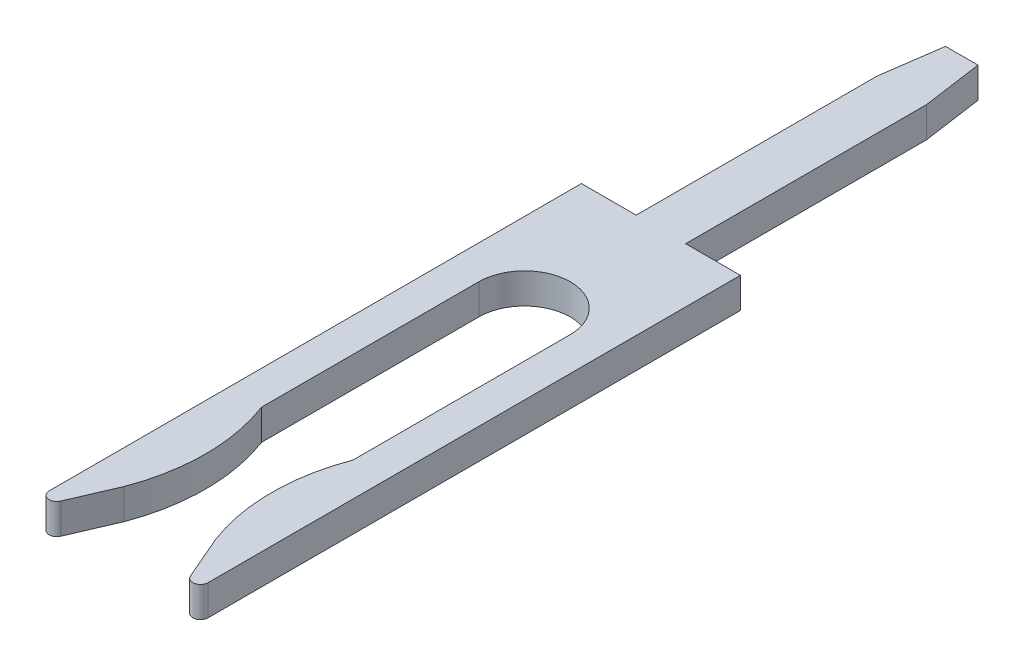
ISO-10303-21;
HEADER;
FILE_DESCRIPTION(('STEP AP214'),'2;1');
FILE_NAME('part.step','',(''),(''),'','','');
FILE_SCHEMA(('AUTOMOTIVE_DESIGN { 1 0 10303 214 1 1 1 1 }'));
ENDSEC;
DATA;
#1=APPLICATION_CONTEXT('core data for automotive mechanical design processes');
#2=APPLICATION_PROTOCOL_DEFINITION('international standard','automotive_design',2000,#1);
#3=PRODUCT_CONTEXT('',#1,'mechanical');
#4=PRODUCT('Part','Part','',(#3));
#5=PRODUCT_RELATED_PRODUCT_CATEGORY('part','',(#4));
#6=PRODUCT_DEFINITION_FORMATION('','',#4);
#7=PRODUCT_DEFINITION_CONTEXT('part definition',#1,'design');
#8=PRODUCT_DEFINITION('design','',#6,#7);
#9=PRODUCT_DEFINITION_SHAPE('','',#8);
#10=(LENGTH_UNIT() NAMED_UNIT(*) SI_UNIT(.MILLI.,.METRE.));
#11=(NAMED_UNIT(*) PLANE_ANGLE_UNIT() SI_UNIT($,.RADIAN.));
#12=(NAMED_UNIT(*) SI_UNIT($,.STERADIAN.) SOLID_ANGLE_UNIT());
#13=UNCERTAINTY_MEASURE_WITH_UNIT(LENGTH_MEASURE(1.E-05),#10,'distance_accuracy_value','');
#14=(GEOMETRIC_REPRESENTATION_CONTEXT(3) GLOBAL_UNCERTAINTY_ASSIGNED_CONTEXT((#13)) GLOBAL_UNIT_ASSIGNED_CONTEXT((#10,
#11,#12)) REPRESENTATION_CONTEXT('',''));
#15=CARTESIAN_POINT('',(0.,0.,0.));
#16=DIRECTION('',(0.,0.,1.));
#17=DIRECTION('',(1.,0.,0.));
#18=AXIS2_PLACEMENT_3D('',#15,#16,#17);
#19=CARTESIAN_POINT('',(8.632444410311,25.29011851254,9.321800116003));
#20=DIRECTION('',(0.918446381343076,2.82422149316493E-08,0.395545502562989));
#21=DIRECTION('',(0.,-1.,7.14006726120006E-08));
#22=AXIS2_PLACEMENT_3D('',#19,#20,#21);
#23=PLANE('',#22);
#24=DIRECTION('',(1.19498744209512E-08,-1.,4.37364344709266E-08));
#25=VECTOR('',#24,1.);
#26=CARTESIAN_POINT('',(8.757767234453,25.29011850133,9.030803774056));
#27=LINE('',#26,#25);
#28=CARTESIAN_POINT('',(8.757767234443,25.29011850132,9.030803774046));
#29=VERTEX_POINT('',#28);
#30=CARTESIAN_POINT('',(8.757767239213,24.89011850132,9.03080379153));
#31=VERTEX_POINT('',#30);
#32=EDGE_CURVE('E11',#29,#31,#27,.T.);
#33=ORIENTED_EDGE('',*,*,#32,.F.);
#34=DIRECTION('',(0.395545502570568,-3.54455188138202E-08,-0.918446381339812));
#35=VECTOR('',#34,1.);
#36=CARTESIAN_POINT('',(8.50712158619,25.29011852378,9.612796457971));
#37=LINE('',#36,#35);
#38=CARTESIAN_POINT('',(8.50712158618,25.29011852377,9.612796457961));
#39=VERTEX_POINT('',#38);
#40=EDGE_CURVE('E195',#39,#29,#37,.T.);
#41=ORIENTED_EDGE('',*,*,#40,.F.);
#42=DIRECTION('',(-1.19498833027412E-08,1.,-4.37364122664564E-08));
#43=VECTOR('',#42,1.);
#44=CARTESIAN_POINT('',(8.50712159096,24.89011852378,9.612796475455));
#45=LINE('',#44,#43);
#46=CARTESIAN_POINT('',(8.50712159095,24.89011852377,9.612796475445));
#47=VERTEX_POINT('',#46);
#48=EDGE_CURVE('E191',#47,#39,#45,.T.);
#49=ORIENTED_EDGE('',*,*,#48,.F.);
#50=DIRECTION('',(-0.395545502570568,3.54455188138202E-08,0.918446381339812));
#51=VECTOR('',#50,1.);
#52=CARTESIAN_POINT('',(8.757767239223,24.89011850133,9.03080379154));
#53=LINE('',#52,#51);
#54=EDGE_CURVE('E316',#31,#47,#53,.T.);
#55=ORIENTED_EDGE('',*,*,#54,.F.);
#56=EDGE_LOOP('',(#33,#41,#49,#55));
#57=FACE_BOUND('',#56,.T.);
#58=ADVANCED_FACE('F17',(#57),#23,.T.);
#59=CARTESIAN_POINT('',(6.375285489489,25.29011843353,8.129930619502));
#60=DIRECTION('',(1.19248806385E-08,-1.,4.371140955778E-08));
#61=DIRECTION('',(1.,1.19248806385E-08,0.));
#62=AXIS2_PLACEMENT_3D('',#59,#60,#61);
#63=CYLINDRICAL_SURFACE('',#62,2.547114388012);
#64=CARTESIAN_POINT('',(6.375285494269,24.89011843354,8.129930636996));
#65=DIRECTION('',(1.19225969351484E-08,-1.,4.37164703841689E-08));
#66=DIRECTION('',(0.935365037457795,-4.30982804777035E-09,-0.353683823070237));
#67=AXIS2_PLACEMENT_3D('',#64,#65,#66);
#68=CIRCLE('',#67,2.54711438802489);
#69=CARTESIAN_POINT('',(8.757767239213,24.89011842256,7.229057482442));
#70=VERTEX_POINT('',#69);
#71=EDGE_CURVE('E308',#70,#31,#68,.T.);
#72=ORIENTED_EDGE('',*,*,#71,.F.);
#73=DIRECTION('',(-1.19498788618512E-08,1.,-4.37364167073564E-08));
#74=VECTOR('',#73,1.);
#75=CARTESIAN_POINT('',(8.757767239223,24.89011842257,7.229057482452));
#76=LINE('',#75,#74);
#77=CARTESIAN_POINT('',(8.757767234443,25.29011842256,7.229057464958));
#78=VERTEX_POINT('',#77);
#79=EDGE_CURVE('E25',#70,#78,#76,.T.);
#80=ORIENTED_EDGE('',*,*,#79,.T.);
#81=CARTESIAN_POINT('',(6.375285489499,25.29011843354,8.129930619512));
#82=DIRECTION('',(-1.19271638076741E-08,1.,-4.37164701822838E-08));
#83=DIRECTION('',(0.935365037457794,2.66180603269365E-08,0.353683823070237));
#84=AXIS2_PLACEMENT_3D('',#81,#82,#83);
#85=CIRCLE('',#84,2.54711438802489);
#86=EDGE_CURVE('E294',#29,#78,#85,.T.);
#87=ORIENTED_EDGE('',*,*,#86,.F.);
#88=ORIENTED_EDGE('',*,*,#32,.T.);
#89=EDGE_LOOP('',(#72,#80,#87,#88));
#90=FACE_BOUND('',#89,.T.);
#91=ADVANCED_FACE('F453',(#90),#63,.T.);
#92=CARTESIAN_POINT('',(8.757767234443,25.29011836024,5.803347405255));
#93=DIRECTION('',(1.,1.19248806385E-08,0.));
#94=DIRECTION('',(0.,0.,-1.));
#95=AXIS2_PLACEMENT_3D('',#92,#93,#94);
#96=PLANE('',#95);
#97=DIRECTION('',(1.19498788618512E-08,-1.,4.37364189277964E-08));
#98=VECTOR('',#97,1.);
#99=CARTESIAN_POINT('',(8.757767234453,25.29011829793,4.377637345563));
#100=LINE('',#99,#98);
#101=CARTESIAN_POINT('',(8.757767234443,25.29011829792,4.377637345553));
#102=VERTEX_POINT('',#101);
#103=CARTESIAN_POINT('',(8.757767239213,24.89011829792,4.377637363037));
#104=VERTEX_POINT('',#103);
#105=EDGE_CURVE('E319',#102,#104,#100,.T.);
#106=ORIENTED_EDGE('',*,*,#105,.F.);
#107=DIRECTION('',(0.,4.371492226186E-08,1.));
#108=VECTOR('',#107,1.);
#109=CARTESIAN_POINT('',(8.757767234453,25.29011829793,4.377637345563));
#110=LINE('',#109,#108);
#111=EDGE_CURVE('E236',#102,#78,#110,.T.);
#112=ORIENTED_EDGE('',*,*,#111,.T.);
#113=ORIENTED_EDGE('',*,*,#79,.F.);
#114=DIRECTION('',(0.,4.371492101591E-08,1.));
#115=VECTOR('',#114,1.);
#116=CARTESIAN_POINT('',(8.757767239223,24.89011829793,4.377637363047));
#117=LINE('',#116,#115);
#118=EDGE_CURVE('E304',#104,#70,#117,.T.);
#119=ORIENTED_EDGE('',*,*,#118,.F.);
#120=EDGE_LOOP('',(#106,#112,#113,#119));
#121=FACE_BOUND('',#120,.T.);
#122=ADVANCED_FACE('F401',(#121),#96,.T.);
#123=CARTESIAN_POINT('',(9.358080406188,25.29011830508,4.377637345553));
#124=DIRECTION('',(1.19248806385E-08,-1.,4.371140955778E-08));
#125=DIRECTION('',(1.,1.19248806385E-08,0.));
#126=AXIS2_PLACEMENT_3D('',#123,#124,#125);
#127=CYLINDRICAL_SURFACE('',#126,0.6003131717443);
#128=DIRECTION('',(-1.19498833027412E-08,1.,-4.37364766593965E-08));
#129=VECTOR('',#128,1.);
#130=CARTESIAN_POINT('',(9.958393582712,24.89011831225,4.377637363047));
#131=LINE('',#130,#129);
#132=CARTESIAN_POINT('',(9.958393582702,24.89011831224,4.377637363037));
#133=VERTEX_POINT('',#132);
#134=CARTESIAN_POINT('',(9.958393577932,25.29011831224,4.377637345553));
#135=VERTEX_POINT('',#134);
#136=EDGE_CURVE('E312',#133,#135,#131,.T.);
#137=ORIENTED_EDGE('',*,*,#136,.T.);
#138=CARTESIAN_POINT('',(9.358080406198,25.29011830509,4.377637345563));
#139=DIRECTION('',(1.19415357801499E-08,-1.,4.37280675288424E-08));
#140=DIRECTION('',(-1.,-1.19415357794208E-08,1.66727672407186E-11));
#141=AXIS2_PLACEMENT_3D('',#138,#139,#140);
#142=CIRCLE('',#141,0.6003131717543);
#143=EDGE_CURVE('E231',#102,#135,#142,.T.);
#144=ORIENTED_EDGE('',*,*,#143,.F.);
#145=ORIENTED_EDGE('',*,*,#105,.T.);
#146=CARTESIAN_POINT('',(9.358080410967,24.89011830509,4.377637363047));
#147=DIRECTION('',(-1.19415357786896E-08,1.,-4.37280675292402E-08));
#148=DIRECTION('',(1.,1.19415357794208E-08,1.67201120446772E-11));
#149=AXIS2_PLACEMENT_3D('',#146,#147,#148);
#150=CIRCLE('',#149,0.6003131717543);
#151=EDGE_CURVE('E260',#133,#104,#150,.T.);
#152=ORIENTED_EDGE('',*,*,#151,.F.);
#153=EDGE_LOOP('',(#137,#144,#145,#152));
#154=FACE_BOUND('',#153,.T.);
#155=ADVANCED_FACE('F392',(#154),#127,.F.);
#156=CARTESIAN_POINT('',(9.958393577932,25.29011837456,5.803347405255));
#157=DIRECTION('',(-1.,-1.19248806385E-08,0.));
#158=DIRECTION('',(-1.19248806385E-08,1.,0.));
#159=AXIS2_PLACEMENT_3D('',#156,#157,#158);
#160=PLANE('',#159);
#161=DIRECTION('',(1.19498833027412E-08,-1.,4.37365232887664E-08));
#162=VECTOR('',#161,1.);
#163=CARTESIAN_POINT('',(9.958393577942,25.29011843689,7.229057464968));
#164=LINE('',#163,#162);
#165=CARTESIAN_POINT('',(9.958393577932,25.29011843688,7.229057464958));
#166=VERTEX_POINT('',#165);
#167=CARTESIAN_POINT('',(9.958393582702,24.89011843688,7.229057482442));
#168=VERTEX_POINT('',#167);
#169=EDGE_CURVE('E309',#166,#168,#164,.T.);
#170=ORIENTED_EDGE('',*,*,#169,.F.);
#171=DIRECTION('',(0.,-4.37149160321299E-08,-1.));
#172=VECTOR('',#171,1.);
#173=CARTESIAN_POINT('',(9.958393577942,25.29011843689,7.229057464968));
#174=LINE('',#173,#172);
#175=EDGE_CURVE('E235',#166,#135,#174,.T.);
#176=ORIENTED_EDGE('',*,*,#175,.T.);
#177=ORIENTED_EDGE('',*,*,#136,.F.);
#178=DIRECTION('',(0.,-4.37149160321299E-08,-1.));
#179=VECTOR('',#178,1.);
#180=CARTESIAN_POINT('',(9.958393582712,24.89011843689,7.229057482452));
#181=LINE('',#180,#179);
#182=EDGE_CURVE('E222',#168,#133,#181,.T.);
#183=ORIENTED_EDGE('',*,*,#182,.F.);
#184=EDGE_LOOP('',(#170,#176,#177,#183));
#185=FACE_BOUND('',#184,.T.);
#186=ADVANCED_FACE('F397',(#185),#160,.T.);
#187=CARTESIAN_POINT('',(12.34087532289,25.29011850467,8.129930619502));
#188=DIRECTION('',(1.19248806385E-08,-1.,4.371140955778E-08));
#189=DIRECTION('',(1.,1.19248806385E-08,0.));
#190=AXIS2_PLACEMENT_3D('',#187,#188,#189);
#191=CYLINDRICAL_SURFACE('',#190,2.547114388012);
#192=DIRECTION('',(-1.19499854432612E-08,1.,-4.37366520746366E-08));
#193=VECTOR('',#192,1.);
#194=CARTESIAN_POINT('',(9.958393582712,24.89011851564,9.03080379154));
#195=LINE('',#194,#193);
#196=CARTESIAN_POINT('',(9.958393582702,24.89011851563,9.03080379153));
#197=VERTEX_POINT('',#196);
#198=CARTESIAN_POINT('',(9.958393577932,25.29011851563,9.030803774046));
#199=VERTEX_POINT('',#198);
#200=EDGE_CURVE('E286',#197,#199,#195,.T.);
#201=ORIENTED_EDGE('',*,*,#200,.T.);
#202=CARTESIAN_POINT('',(12.3408753229,25.29011850468,8.129930619512));
#203=DIRECTION('',(-1.192716380767E-08,1.,-4.37164701822821E-08));
#204=DIRECTION('',(-0.935365037457761,-2.66180603269356E-08,-0.353683823070325));
#205=AXIS2_PLACEMENT_3D('',#202,#203,#204);
#206=CIRCLE('',#205,2.54711438802489);
#207=EDGE_CURVE('E274',#166,#199,#206,.T.);
#208=ORIENTED_EDGE('',*,*,#207,.F.);
#209=ORIENTED_EDGE('',*,*,#169,.T.);
#210=CARTESIAN_POINT('',(12.34087532767,24.89011850468,8.129930636996));
#211=DIRECTION('',(1.19225969351525E-08,-1.,4.37164703841673E-08));
#212=DIRECTION('',(-0.935365037457761,4.30982804777019E-09,0.353683823070325));
#213=AXIS2_PLACEMENT_3D('',#210,#211,#212);
#214=CIRCLE('',#213,2.54711438802489);
#215=EDGE_CURVE('E218',#197,#168,#214,.T.);
#216=ORIENTED_EDGE('',*,*,#215,.F.);
#217=EDGE_LOOP('',(#201,#208,#209,#216));
#218=FACE_BOUND('',#217,.T.);
#219=ADVANCED_FACE('F409',(#218),#191,.T.);
#220=CARTESIAN_POINT('',(10.08371640206,25.29011852985,9.321800116003));
#221=DIRECTION('',(-0.918446381343077,6.33748799088984E-09,0.39554550256299));
#222=DIRECTION('',(6.9002264254363E-09,1.,0.));
#223=AXIS2_PLACEMENT_3D('',#220,#221,#222);
#224=PLANE('',#223);
#225=DIRECTION('',(1.19498033666812E-08,-1.,4.37362301898864E-08));
#226=VECTOR('',#225,1.);
#227=CARTESIAN_POINT('',(10.20903922621,25.29011854407,9.612796457971));
#228=LINE('',#227,#226);
#229=CARTESIAN_POINT('',(10.2090392262,25.29011854406,9.612796457961));
#230=VERTEX_POINT('',#229);
#231=CARTESIAN_POINT('',(10.20903923097,24.89011854406,9.612796475445));
#232=VERTEX_POINT('',#231);
#233=EDGE_CURVE('E283',#230,#232,#228,.T.);
#234=ORIENTED_EDGE('',*,*,#233,.F.);
#235=DIRECTION('',(0.395545502570568,4.48792459683343E-08,0.918446381339812));
#236=VECTOR('',#235,1.);
#237=CARTESIAN_POINT('',(9.958393577942,25.29011851564,9.030803774056));
#238=LINE('',#237,#236);
#239=EDGE_CURVE('E252',#199,#230,#238,.T.);
#240=ORIENTED_EDGE('',*,*,#239,.F.);
#241=ORIENTED_EDGE('',*,*,#200,.F.);
#242=DIRECTION('',(-0.395545502570568,-4.48791955093044E-08,-0.918446381339812));
#243=VECTOR('',#242,1.);
#244=CARTESIAN_POINT('',(10.20903923098,24.89011854407,9.612796475455));
#245=LINE('',#244,#243);
#246=EDGE_CURVE('E223',#232,#197,#245,.T.);
#247=ORIENTED_EDGE('',*,*,#246,.F.);
#248=EDGE_LOOP('',(#234,#240,#241,#247));
#249=FACE_BOUND('',#248,.T.);
#250=ADVANCED_FACE('F414',(#249),#224,.T.);
#251=CARTESIAN_POINT('',(10.30088386433,25.29011854343,9.573241907704));
#252=DIRECTION('',(1.19248806385E-08,-1.,4.371140955778E-08));
#253=DIRECTION('',(1.,1.19248806385E-08,0.));
#254=AXIS2_PLACEMENT_3D('',#251,#252,#253);
#255=CYLINDRICAL_SURFACE('',#254,0.1);
#256=DIRECTION('',(-1.19499188298712E-08,1.,-4.37364033846764E-08));
#257=VECTOR('',#256,1.);
#258=CARTESIAN_POINT('',(10.40088386911,24.89011854463,9.573241925199));
#259=LINE('',#258,#257);
#260=CARTESIAN_POINT('',(10.4008838691,24.89011854462,9.573241925189));
#261=VERTEX_POINT('',#260);
#262=CARTESIAN_POINT('',(10.40088386433,25.29011854462,9.573241907704));
#263=VERTEX_POINT('',#262);
#264=EDGE_CURVE('E287',#261,#263,#259,.T.);
#265=ORIENTED_EDGE('',*,*,#264,.T.);
#266=CARTESIAN_POINT('',(10.30088386434,25.29011854344,9.573241907714));
#267=DIRECTION('',(-1.18726045320449E-08,1.,-4.38428027187522E-08));
#268=DIRECTION('',(-0.918446381322305,6.43747276794604E-09,0.395545502611221));
#269=AXIS2_PLACEMENT_3D('',#266,#267,#268);
#270=CIRCLE('',#269,0.10000000001314);
#271=EDGE_CURVE('E247',#230,#263,#270,.T.);
#272=ORIENTED_EDGE('',*,*,#271,.F.);
#273=ORIENTED_EDGE('',*,*,#233,.T.);
#274=CARTESIAN_POINT('',(10.30088386911,24.89011854344,9.573241925199));
#275=DIRECTION('',(1.20248966201232E-08,-1.,4.38114095546013E-08));
#276=DIRECTION('',(1.,1.20248966245075E-08,1.00071054263569E-10));
#277=AXIS2_PLACEMENT_3D('',#274,#275,#276);
#278=CIRCLE('',#277,0.10000000001);
#279=EDGE_CURVE('E246',#261,#232,#278,.T.);
#280=ORIENTED_EDGE('',*,*,#279,.F.);
#281=EDGE_LOOP('',(#265,#272,#273,#280));
#282=FACE_BOUND('',#281,.T.);
#283=ADVANCED_FACE('F417',(#282),#255,.T.);
#284=CARTESIAN_POINT('',(10.40088386433,25.29011839196,6.080748315806));
#285=DIRECTION('',(1.,1.19248806385E-08,0.));
#286=DIRECTION('',(0.,0.,-1.));
#287=AXIS2_PLACEMENT_3D('',#284,#285,#286);
#288=PLANE('',#287);
#289=DIRECTION('',(-1.19499188298812E-08,1.,-4.37364056051264E-08));
#290=VECTOR('',#289,1.);
#291=CARTESIAN_POINT('',(10.40088386911,24.89011823931,2.588254741401));
#292=LINE('',#291,#290);
#293=CARTESIAN_POINT('',(10.4008838691,24.8901182393,2.588254741391));
#294=VERTEX_POINT('',#293);
#295=CARTESIAN_POINT('',(10.40088386433,25.2901182393,2.588254723907));
#296=VERTEX_POINT('',#295);
#297=EDGE_CURVE('E355',#294,#296,#292,.T.);
#298=ORIENTED_EDGE('',*,*,#297,.T.);
#299=DIRECTION('',(0.,4.37128436385411E-08,1.));
#300=VECTOR('',#299,1.);
#301=CARTESIAN_POINT('',(10.40088386434,25.29011823931,2.588254723917));
#302=LINE('',#301,#300);
#303=EDGE_CURVE('E251',#296,#263,#302,.T.);
#304=ORIENTED_EDGE('',*,*,#303,.T.);
#305=ORIENTED_EDGE('',*,*,#264,.F.);
#306=DIRECTION('',(0.,4.37128390609411E-08,1.));
#307=VECTOR('',#306,1.);
#308=CARTESIAN_POINT('',(10.40088386911,24.89011823931,2.588254741401));
#309=LINE('',#308,#307);
#310=EDGE_CURVE('E282',#294,#261,#309,.T.);
#311=ORIENTED_EDGE('',*,*,#310,.F.);
#312=EDGE_LOOP('',(#298,#304,#305,#311));
#313=FACE_BOUND('',#312,.T.);
#314=ADVANCED_FACE('F420',(#313),#288,.T.);
#315=CARTESIAN_POINT('',(10.04171694873,25.29011823501,2.588254723907));
#316=DIRECTION('',(0.,-4.371140955778E-08,-1.));
#317=DIRECTION('',(0.,-1.,4.371140955778E-08));
#318=AXIS2_PLACEMENT_3D('',#315,#316,#317);
#319=PLANE('',#318);
#320=DIRECTION('',(-1.19498877436312E-08,1.,-4.37364067153464E-08));
#321=VECTOR('',#320,1.);
#322=CARTESIAN_POINT('',(9.682550037905,24.89011823074,2.588254741401));
#323=LINE('',#322,#321);
#324=CARTESIAN_POINT('',(9.682550037895,24.89011823073,2.588254741391));
#325=VERTEX_POINT('',#324);
#326=CARTESIAN_POINT('',(9.682550033125,25.29011823073,2.588254723907));
#327=VERTEX_POINT('',#326);
#328=EDGE_CURVE('E323',#325,#327,#323,.T.);
#329=ORIENTED_EDGE('',*,*,#328,.T.);
#330=DIRECTION('',(1.,1.19387603365643E-08,0.));
#331=VECTOR('',#330,1.);
#332=CARTESIAN_POINT('',(9.682550033135,25.29011823074,2.588254723917));
#333=LINE('',#332,#331);
#334=EDGE_CURVE('E269',#327,#296,#333,.T.);
#335=ORIENTED_EDGE('',*,*,#334,.T.);
#336=ORIENTED_EDGE('',*,*,#297,.F.);
#337=DIRECTION('',(1.,1.19387652823343E-08,0.));
#338=VECTOR('',#337,1.);
#339=CARTESIAN_POINT('',(9.682550037905,24.89011823074,2.588254741401));
#340=LINE('',#339,#338);
#341=EDGE_CURVE('E278',#325,#294,#340,.T.);
#342=ORIENTED_EDGE('',*,*,#341,.F.);
#343=EDGE_LOOP('',(#329,#335,#336,#342));
#344=FACE_BOUND('',#343,.T.);
#345=ADVANCED_FACE('F424',(#344),#319,.T.);
#346=CARTESIAN_POINT('',(9.682550033125,25.29011799994,-2.691580134093));
#347=DIRECTION('',(1.,1.19248806385E-08,0.));
#348=DIRECTION('',(0.,0.,-1.));
#349=AXIS2_PLACEMENT_3D('',#346,#347,#348);
#350=PLANE('',#349);
#351=DIRECTION('',(-1.19498877436312E-08,1.,-4.37364097684565E-08));
#352=VECTOR('',#351,1.);
#353=CARTESIAN_POINT('',(9.682550037905,24.89011809263,-0.5714149746181));
#354=LINE('',#353,#352);
#355=CARTESIAN_POINT('',(9.682550037895,24.89011809262,-0.5714149746081));
#356=VERTEX_POINT('',#355);
#357=CARTESIAN_POINT('',(9.682550033125,25.29011809262,-0.5714149920927));
#358=VERTEX_POINT('',#357);
#359=EDGE_CURVE('E320',#356,#358,#354,.T.);
#360=ORIENTED_EDGE('',*,*,#359,.T.);
#361=DIRECTION('',(0.,4.37145787910884E-08,1.));
#362=VECTOR('',#361,1.);
#363=CARTESIAN_POINT('',(9.682550033135,25.29011809263,-0.5714149921027));
#364=LINE('',#363,#362);
#365=EDGE_CURVE('E273',#358,#327,#364,.T.);
#366=ORIENTED_EDGE('',*,*,#365,.T.);
#367=ORIENTED_EDGE('',*,*,#328,.F.);
#368=DIRECTION('',(0.,4.37145776666985E-08,1.));
#369=VECTOR('',#368,1.);
#370=CARTESIAN_POINT('',(9.682550037905,24.89011809263,-0.5714149746181));
#371=LINE('',#370,#369);
#372=EDGE_CURVE('E268',#356,#325,#371,.T.);
#373=ORIENTED_EDGE('',*,*,#372,.F.);
#374=EDGE_LOOP('',(#360,#366,#367,#373));
#375=FACE_BOUND('',#374,.T.);
#376=ADVANCED_FACE('F428',(#375),#350,.T.);
#377=CARTESIAN_POINT('',(9.626815219656,25.29011807473,-0.9654931957117));
#378=DIRECTION('',(0.990146240248787,5.68615146288093E-09,-0.140037219770998));
#379=DIRECTION('',(0.,-1.,-4.06045726427549E-08));
#380=AXIS2_PLACEMENT_3D('',#377,#378,#379);
#381=PLANE('',#380);
#382=DIRECTION('',(-1.19498833027412E-08,1.,-4.37364067153464E-08));
#383=VECTOR('',#382,1.);
#384=CARTESIAN_POINT('',(9.571080410967,24.89011805685,-1.359571381856));
#385=LINE('',#384,#383);
#386=CARTESIAN_POINT('',(9.571080410957,24.89011805684,-1.359571381846));
#387=VERTEX_POINT('',#386);
#388=CARTESIAN_POINT('',(9.571080406188,25.29011805684,-1.359571399331));
#389=VERTEX_POINT('',#388);
#390=EDGE_CURVE('E324',#387,#389,#385,.T.);
#391=ORIENTED_EDGE('',*,*,#390,.T.);
#392=DIRECTION('',(-0.140037219781573,-4.49631744438713E-08,-0.990146240247291));
#393=VECTOR('',#392,1.);
#394=CARTESIAN_POINT('',(9.682550033135,25.29011809263,-0.5714149921027));
#395=LINE('',#394,#393);
#396=EDGE_CURVE('E352',#358,#389,#395,.T.);
#397=ORIENTED_EDGE('',*,*,#396,.F.);
#398=ORIENTED_EDGE('',*,*,#359,.F.);
#399=DIRECTION('',(0.140037219781573,4.49632190759613E-08,0.990146240247291));
#400=VECTOR('',#399,1.);
#401=CARTESIAN_POINT('',(9.571080410967,24.89011805685,-1.359571381856));
#402=LINE('',#401,#400);
#403=EDGE_CURVE('E264',#387,#356,#402,.T.);
#404=ORIENTED_EDGE('',*,*,#403,.F.);
#405=EDGE_LOOP('',(#391,#397,#398,#404));
#406=FACE_BOUND('',#405,.T.);
#407=ADVANCED_FACE('F432',(#406),#381,.T.);
#408=CARTESIAN_POINT('',(9.251580406188,25.29011805303,-1.359571399331));
#409=DIRECTION('',(0.,-4.371140955778E-08,-1.));
#410=DIRECTION('',(0.,-1.,4.371140955778E-08));
#411=AXIS2_PLACEMENT_3D('',#408,#409,#410);
#412=PLANE('',#411);
#413=DIRECTION('',(-1.19498744209512E-08,1.,-4.37364061602266E-08));
#414=VECTOR('',#413,1.);
#415=CARTESIAN_POINT('',(9.145080410967,24.89011805177,-1.359571381856));
#416=LINE('',#415,#414);
#417=CARTESIAN_POINT('',(9.145080410957,24.89011805176,-1.359571381846));
#418=VERTEX_POINT('',#417);
#419=CARTESIAN_POINT('',(9.145080406188,25.29011805176,-1.359571399331));
#420=VERTEX_POINT('',#419);
#421=EDGE_CURVE('E376',#418,#420,#416,.T.);
#422=ORIENTED_EDGE('',*,*,#421,.T.);
#423=DIRECTION('',(1.,1.19482743968633E-08,0.));
#424=VECTOR('',#423,1.);
#425=CARTESIAN_POINT('',(9.145080406198,25.29011805177,-1.359571399341));
#426=LINE('',#425,#424);
#427=EDGE_CURVE('E359',#420,#389,#426,.T.);
#428=ORIENTED_EDGE('',*,*,#427,.T.);
#429=ORIENTED_EDGE('',*,*,#390,.F.);
#430=DIRECTION('',(1.,1.19482827365733E-08,0.));
#431=VECTOR('',#430,1.);
#432=CARTESIAN_POINT('',(9.145080410967,24.89011805177,-1.359571381856));
#433=LINE('',#432,#431);
#434=EDGE_CURVE('E256',#418,#387,#433,.T.);
#435=ORIENTED_EDGE('',*,*,#434,.F.);
#436=EDGE_LOOP('',(#422,#428,#429,#435));
#437=FACE_BOUND('',#436,.T.);
#438=ADVANCED_FACE('F435',(#437),#412,.T.);
#439=CARTESIAN_POINT('',(9.089345592719,25.29011806832,-0.9654931957117));
#440=DIRECTION('',(-0.990146240248787,-1.79285999963698E-08,-0.140037219770998));
#441=DIRECTION('',(-0.140037219770998,0.,0.990146240248787));
#442=AXIS2_PLACEMENT_3D('',#439,#440,#441);
#443=PLANE('',#442);
#444=DIRECTION('',(-1.19498788618512E-08,1.,-4.37364100460164E-08));
#445=VECTOR('',#444,1.);
#446=CARTESIAN_POINT('',(9.03361078403,24.89011808489,-0.5714149746181));
#447=LINE('',#446,#445);
#448=CARTESIAN_POINT('',(9.03361078402,24.89011808488,-0.5714149746081));
#449=VERTEX_POINT('',#448);
#450=CARTESIAN_POINT('',(9.03361077925,25.29011808488,-0.5714149920927));
#451=VERTEX_POINT('',#450);
#452=EDGE_CURVE('E47',#449,#451,#447,.T.);
#453=ORIENTED_EDGE('',*,*,#452,.T.);
#454=DIRECTION('',(-0.140037219781573,4.16233022348688E-08,0.990146240247291));
#455=VECTOR('',#454,1.);
#456=CARTESIAN_POINT('',(9.145080406198,25.29011805177,-1.359571399341));
#457=LINE('',#456,#455);
#458=EDGE_CURVE('E363',#420,#451,#457,.T.);
#459=ORIENTED_EDGE('',*,*,#458,.F.);
#460=ORIENTED_EDGE('',*,*,#421,.F.);
#461=DIRECTION('',(0.140037219781573,-4.16233513301588E-08,-0.990146240247291));
#462=VECTOR('',#461,1.);
#463=CARTESIAN_POINT('',(9.03361078403,24.89011808489,-0.5714149746181));
#464=LINE('',#463,#462);
#465=EDGE_CURVE('E242',#449,#418,#464,.T.);
#466=ORIENTED_EDGE('',*,*,#465,.F.);
#467=EDGE_LOOP('',(#453,#459,#460,#466));
#468=FACE_BOUND('',#467,.T.);
#469=ADVANCED_FACE('F437',(#468),#443,.T.);
#470=CARTESIAN_POINT('',(9.03361077925,25.2901179922,-2.691580134093));
#471=DIRECTION('',(-1.,-1.19248806385E-08,0.));
#472=DIRECTION('',(-1.19248806385E-08,1.,0.));
#473=AXIS2_PLACEMENT_3D('',#470,#471,#472);
#474=PLANE('',#473);
#475=DIRECTION('',(-1.19498788618512E-08,1.,-4.37364056051264E-08));
#476=VECTOR('',#475,1.);
#477=CARTESIAN_POINT('',(9.03361078403,24.890118223,2.588254741401));
#478=LINE('',#477,#476);
#479=CARTESIAN_POINT('',(9.03361078402,24.89011822299,2.588254741391));
#480=VERTEX_POINT('',#479);
#481=CARTESIAN_POINT('',(9.03361077925,25.29011822299,2.588254723907));
#482=VERTEX_POINT('',#481);
#483=EDGE_CURVE('E37',#480,#482,#478,.T.);
#484=ORIENTED_EDGE('',*,*,#483,.T.);
#485=DIRECTION('',(0.,-4.37145664227585E-08,-1.));
#486=VECTOR('',#485,1.);
#487=CARTESIAN_POINT('',(9.03361077926,25.290118223,2.588254723917));
#488=LINE('',#487,#486);
#489=EDGE_CURVE('E367',#482,#451,#488,.T.);
#490=ORIENTED_EDGE('',*,*,#489,.T.);
#491=ORIENTED_EDGE('',*,*,#452,.F.);
#492=DIRECTION('',(0.,-4.37145652983684E-08,-1.));
#493=VECTOR('',#492,1.);
#494=CARTESIAN_POINT('',(9.03361078403,24.890118223,2.588254741401));
#495=LINE('',#494,#493);
#496=EDGE_CURVE('E228',#480,#449,#495,.T.);
#497=ORIENTED_EDGE('',*,*,#496,.F.);
#498=EDGE_LOOP('',(#484,#490,#491,#497));
#499=FACE_BOUND('',#498,.T.);
#500=ADVANCED_FACE('F439',(#499),#474,.T.);
#501=CARTESIAN_POINT('',(8.674443863648,25.29011821871,2.588254723907));
#502=DIRECTION('',(0.,-4.371140955778E-08,-1.));
#503=DIRECTION('',(0.,-1.,4.371140955778E-08));
#504=AXIS2_PLACEMENT_3D('',#501,#502,#503);
#505=PLANE('',#504);
#506=DIRECTION('',(-1.19498788618512E-08,1.,-4.37364067153464E-08));
#507=VECTOR('',#506,1.);
#508=CARTESIAN_POINT('',(8.315276952825,24.89011821444,2.588254741401));
#509=LINE('',#508,#507);
#510=CARTESIAN_POINT('',(8.315276952815,24.89011821443,2.588254741391));
#511=VERTEX_POINT('',#510);
#512=CARTESIAN_POINT('',(8.315276948045,25.29011821443,2.588254723907));
#513=VERTEX_POINT('',#512);
#514=EDGE_CURVE('E206',#511,#513,#509,.T.);
#515=ORIENTED_EDGE('',*,*,#514,.T.);
#516=DIRECTION('',(1.,1.19387949569543E-08,0.));
#517=VECTOR('',#516,1.);
#518=CARTESIAN_POINT('',(8.315276948055,25.29011821444,2.588254723917));
#519=LINE('',#518,#517);
#520=EDGE_CURVE('E201',#513,#482,#519,.T.);
#521=ORIENTED_EDGE('',*,*,#520,.T.);
#522=ORIENTED_EDGE('',*,*,#483,.F.);
#523=DIRECTION('',(1.,1.19387999027243E-08,0.));
#524=VECTOR('',#523,1.);
#525=CARTESIAN_POINT('',(8.315276952825,24.89011821444,2.588254741401));
#526=LINE('',#525,#524);
#527=EDGE_CURVE('E224',#511,#480,#526,.T.);
#528=ORIENTED_EDGE('',*,*,#527,.F.);
#529=EDGE_LOOP('',(#515,#521,#522,#528));
#530=FACE_BOUND('',#529,.T.);
#531=ADVANCED_FACE('F447',(#530),#505,.T.);
#532=CARTESIAN_POINT('',(9.358080406188,25.29011820046,1.984277313328));
#533=DIRECTION('',(1.19248806385E-08,-1.,4.371140955778E-08));
#534=DIRECTION('',(-1.,-1.19248806385E-08,0.));
#535=AXIS2_PLACEMENT_3D('',#532,#533,#534);
#536=PLANE('',#535);
#537=DIRECTION('',(0.,-4.3712841604051E-08,-1.));
#538=VECTOR('',#537,1.);
#539=CARTESIAN_POINT('',(8.315276948055,25.29011851976,9.573241907714));
#540=LINE('',#539,#538);
#541=CARTESIAN_POINT('',(8.315276948045,25.29011851975,9.573241907704));
#542=VERTEX_POINT('',#541);
#543=EDGE_CURVE('E198',#542,#513,#540,.T.);
#544=ORIENTED_EDGE('',*,*,#543,.F.);
#545=CARTESIAN_POINT('',(8.415276948055,25.29011852095,9.573241907714));
#546=DIRECTION('',(-1.20248966289159E-08,1.,-4.38114095521961E-08));
#547=DIRECTION('',(-1.,-1.20248966245075E-08,1.00621724883728E-10));
#548=AXIS2_PLACEMENT_3D('',#545,#546,#547);
#549=CIRCLE('',#548,0.10000000001);
#550=EDGE_CURVE('E185',#542,#39,#549,.T.);
#551=ORIENTED_EDGE('',*,*,#550,.T.);
#552=ORIENTED_EDGE('',*,*,#40,.T.);
#553=ORIENTED_EDGE('',*,*,#86,.T.);
#554=ORIENTED_EDGE('',*,*,#111,.F.);
#555=ORIENTED_EDGE('',*,*,#143,.T.);
#556=ORIENTED_EDGE('',*,*,#175,.F.);
#557=ORIENTED_EDGE('',*,*,#207,.T.);
#558=ORIENTED_EDGE('',*,*,#239,.T.);
#559=ORIENTED_EDGE('',*,*,#271,.T.);
#560=ORIENTED_EDGE('',*,*,#303,.F.);
#561=ORIENTED_EDGE('',*,*,#334,.F.);
#562=ORIENTED_EDGE('',*,*,#365,.F.);
#563=ORIENTED_EDGE('',*,*,#396,.T.);
#564=ORIENTED_EDGE('',*,*,#427,.F.);
#565=ORIENTED_EDGE('',*,*,#458,.T.);
#566=ORIENTED_EDGE('',*,*,#489,.F.);
#567=ORIENTED_EDGE('',*,*,#520,.F.);
#568=EDGE_LOOP('',(#544,#551,#552,#553,#554,#555,#556,#557,#558,#559,#560,#561,#562,#563,#564,
#565,#566,#567));
#569=FACE_BOUND('',#568,.T.);
#570=ADVANCED_FACE('F199',(#569),#536,.F.);
#571=CARTESIAN_POINT('',(8.415276948045,25.29011852094,9.573241907704));
#572=DIRECTION('',(1.19248806385E-08,-1.,4.371140955778E-08));
#573=DIRECTION('',(1.,1.19248806385E-08,0.));
#574=AXIS2_PLACEMENT_3D('',#571,#572,#573);
#575=CYLINDRICAL_SURFACE('',#574,0.1);
#576=ORIENTED_EDGE('',*,*,#48,.T.);
#577=ORIENTED_EDGE('',*,*,#550,.F.);
#578=DIRECTION('',(1.19498744209512E-08,-1.,4.37363545348664E-08));
#579=VECTOR('',#578,1.);
#580=CARTESIAN_POINT('',(8.315276948055,25.29011851976,9.573241907714));
#581=LINE('',#580,#579);
#582=CARTESIAN_POINT('',(8.315276952815,24.89011851975,9.573241925189));
#583=VERTEX_POINT('',#582);
#584=EDGE_CURVE('E190',#542,#583,#581,.T.);
#585=ORIENTED_EDGE('',*,*,#584,.T.);
#586=CARTESIAN_POINT('',(8.415276952825,24.89011852095,9.573241925199));
#587=DIRECTION('',(1.19771811962047E-08,-1.,4.38428132517207E-08));
#588=DIRECTION('',(0.918446381322429,2.83422263316263E-08,0.395545502610931));
#589=AXIS2_PLACEMENT_3D('',#586,#587,#588);
#590=CIRCLE('',#589,0.10000000001314);
#591=EDGE_CURVE('E328',#47,#583,#590,.T.);
#592=ORIENTED_EDGE('',*,*,#591,.F.);
#593=EDGE_LOOP('',(#576,#577,#585,#592));
#594=FACE_BOUND('',#593,.T.);
#595=ADVANCED_FACE('F187',(#594),#575,.T.);
#596=CARTESIAN_POINT('',(9.358080410957,24.89011820046,1.984277330813));
#597=DIRECTION('',(1.19248806385E-08,-1.,4.371140955778E-08));
#598=DIRECTION('',(-1.,-1.19248806385E-08,0.));
#599=AXIS2_PLACEMENT_3D('',#596,#597,#598);
#600=PLANE('',#599);
#601=ORIENTED_EDGE('',*,*,#527,.T.);
#602=ORIENTED_EDGE('',*,*,#496,.T.);
#603=ORIENTED_EDGE('',*,*,#465,.T.);
#604=ORIENTED_EDGE('',*,*,#434,.T.);
#605=ORIENTED_EDGE('',*,*,#403,.T.);
#606=ORIENTED_EDGE('',*,*,#372,.T.);
#607=ORIENTED_EDGE('',*,*,#341,.T.);
#608=ORIENTED_EDGE('',*,*,#310,.T.);
#609=ORIENTED_EDGE('',*,*,#279,.T.);
#610=ORIENTED_EDGE('',*,*,#246,.T.);
#611=ORIENTED_EDGE('',*,*,#215,.T.);
#612=ORIENTED_EDGE('',*,*,#182,.T.);
#613=ORIENTED_EDGE('',*,*,#151,.T.);
#614=ORIENTED_EDGE('',*,*,#118,.T.);
#615=ORIENTED_EDGE('',*,*,#71,.T.);
#616=ORIENTED_EDGE('',*,*,#54,.T.);
#617=ORIENTED_EDGE('',*,*,#591,.T.);
#618=DIRECTION('',(0.,-4.37128421126711E-08,-1.));
#619=VECTOR('',#618,1.);
#620=CARTESIAN_POINT('',(8.315276952825,24.89011851976,9.573241925199));
#621=LINE('',#620,#619);
#622=EDGE_CURVE('E211',#583,#511,#621,.T.);
#623=ORIENTED_EDGE('',*,*,#622,.T.);
#624=EDGE_LOOP('',(#601,#602,#603,#604,#605,#606,#607,#608,#609,#610,#611,#612,#613,#614,#615,
#616,#617,#623));
#625=FACE_BOUND('',#624,.T.);
#626=ADVANCED_FACE('F405',(#625),#600,.T.);
#627=CARTESIAN_POINT('',(8.315276948045,25.29011836709,6.080748315806));
#628=DIRECTION('',(-1.,-1.19248806385E-08,0.));
#629=DIRECTION('',(-1.19248806385E-08,1.,0.));
#630=AXIS2_PLACEMENT_3D('',#627,#628,#629);
#631=PLANE('',#630);
#632=ORIENTED_EDGE('',*,*,#584,.F.);
#633=ORIENTED_EDGE('',*,*,#543,.T.);
#634=ORIENTED_EDGE('',*,*,#514,.F.);
#635=ORIENTED_EDGE('',*,*,#622,.F.);
#636=EDGE_LOOP('',(#632,#633,#634,#635));
#637=FACE_BOUND('',#636,.T.);
#638=ADVANCED_FACE('F209',(#637),#631,.T.);
#639=CLOSED_SHELL('',(#58,#91,#122,#155,#186,#219,#250,#283,#314,#345,#376,#407,#438,#469,#500,
#531,#570,#595,#626,#638));
#640=MANIFOLD_SOLID_BREP('B1',#639);
#641=ADVANCED_BREP_SHAPE_REPRESENTATION('',(#18,#640),#14);
#642=SHAPE_DEFINITION_REPRESENTATION(#9,#641);
ENDSEC;
END-ISO-10303-21;
